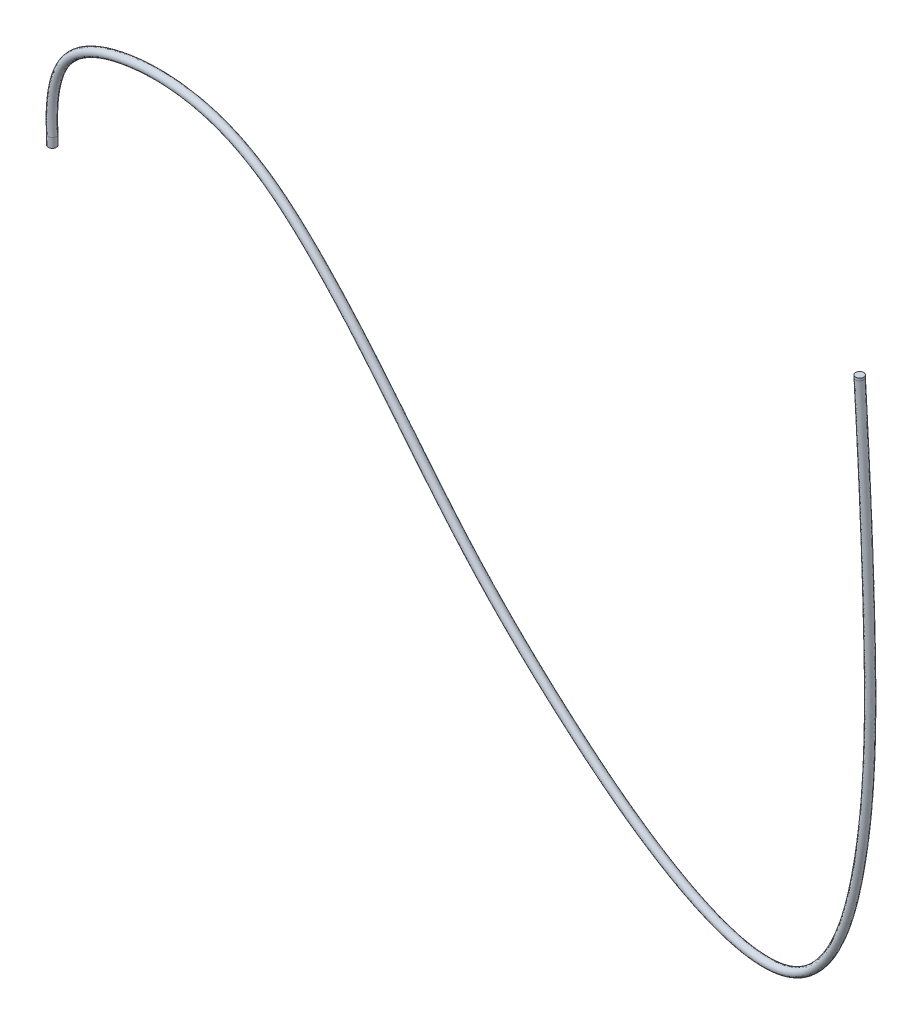
ISO-10303-21;
HEADER;
FILE_DESCRIPTION(('STEP AP214'),'2;1');
FILE_NAME('part.step','',(''),(''),'','','');
FILE_SCHEMA(('AUTOMOTIVE_DESIGN { 1 0 10303 214 1 1 1 1 }'));
ENDSEC;
DATA;
#1=APPLICATION_CONTEXT('core data for automotive mechanical design processes');
#2=APPLICATION_PROTOCOL_DEFINITION('international standard','automotive_design',2000,#1);
#3=PRODUCT_CONTEXT('',#1,'mechanical');
#4=PRODUCT('Part','Part','',(#3));
#5=PRODUCT_RELATED_PRODUCT_CATEGORY('part','',(#4));
#6=PRODUCT_DEFINITION_FORMATION('','',#4);
#7=PRODUCT_DEFINITION_CONTEXT('part definition',#1,'design');
#8=PRODUCT_DEFINITION('design','',#6,#7);
#9=PRODUCT_DEFINITION_SHAPE('','',#8);
#10=(LENGTH_UNIT() NAMED_UNIT(*) SI_UNIT(.MILLI.,.METRE.));
#11=(NAMED_UNIT(*) PLANE_ANGLE_UNIT() SI_UNIT($,.RADIAN.));
#12=(NAMED_UNIT(*) SI_UNIT($,.STERADIAN.) SOLID_ANGLE_UNIT());
#13=UNCERTAINTY_MEASURE_WITH_UNIT(LENGTH_MEASURE(1.E-05),#10,'distance_accuracy_value','');
#14=(GEOMETRIC_REPRESENTATION_CONTEXT(3) GLOBAL_UNCERTAINTY_ASSIGNED_CONTEXT((#13)) GLOBAL_UNIT_ASSIGNED_CONTEXT((#10,
#11,#12)) REPRESENTATION_CONTEXT('',''));
#15=CARTESIAN_POINT('',(0.,0.,0.));
#16=DIRECTION('',(0.,0.,1.));
#17=DIRECTION('',(1.,0.,0.));
#18=AXIS2_PLACEMENT_3D('',#15,#16,#17);
#19=CARTESIAN_POINT('',(0.,0.,0.));
#20=DIRECTION('',(0.,1.,0.));
#21=DIRECTION('',(0.,0.,1.));
#22=AXIS2_PLACEMENT_3D('',#19,#20,#21);
#23=PLANE('',#22);
#24=CARTESIAN_POINT('',(0.,0.,0.));
#25=DIRECTION('',(0.,1.,0.));
#26=DIRECTION('',(0.,0.,1.));
#27=AXIS2_PLACEMENT_3D('',#24,#25,#26);
#28=CIRCLE('',#27,2.);
#29=CARTESIAN_POINT('',(0.,0.,2.));
#30=VERTEX_POINT('',#29);
#31=EDGE_CURVE('E10',#30,#30,#28,.T.);
#32=ORIENTED_EDGE('',*,*,#31,.T.);
#33=EDGE_LOOP('',(#32));
#34=FACE_BOUND('',#33,.T.);
#35=ADVANCED_FACE('F32',(#34),#23,.T.);
#36=CARTESIAN_POINT('',(0.,-6.91801695001233,0.));
#37=DIRECTION('',(0.,1.,0.));
#38=DIRECTION('',(0.,0.,1.));
#39=AXIS2_PLACEMENT_3D('',#36,#37,#38);
#40=CYLINDRICAL_SURFACE('',#39,2.);
#41=ORIENTED_EDGE('',*,*,#31,.F.);
#42=EDGE_LOOP('',(#41));
#43=FACE_BOUND('',#42,.T.);
#44=CARTESIAN_POINT('',(2.,-1.20167860101731,0.));
#45=CARTESIAN_POINT('',(2.,-1.20167860101731,-3.99999999999999));
#46=CARTESIAN_POINT('',(-2.,-1.32064680002261,-3.99999999999999));
#47=CARTESIAN_POINT('',(-2.,-1.32064680002261,0.));
#48=CARTESIAN_POINT('',(-2.,-1.32064680002261,3.99999999999999));
#49=CARTESIAN_POINT('',(2.,-1.20167860101731,3.99999999999999));
#50=CARTESIAN_POINT('',(2.,-1.20167860101731,0.));
#51=(BOUNDED_CURVE() B_SPLINE_CURVE(3,(#44,#45,#46,#47,#48,#49,#50),.UNSPECIFIED.,.T.,
.F.) B_SPLINE_CURVE_WITH_KNOTS((4,3,4),(0.,0.5,1.),
.UNSPECIFIED.) CURVE() GEOMETRIC_REPRESENTATION_ITEM() RATIONAL_B_SPLINE_CURVE((1.,
0.333333333333333,0.333333333333333,1.,0.333333333333333,0.333333333333333,1.)) REPRESENTATION_ITEM(''));
#52=CARTESIAN_POINT('',(2.,-1.20167860101731,0.));
#53=VERTEX_POINT('',#52);
#54=EDGE_CURVE('E43',#53,#53,#51,.T.);
#55=ORIENTED_EDGE('',*,*,#54,.T.);
#56=EDGE_LOOP('',(#55));
#57=FACE_BOUND('',#56,.T.);
#58=ADVANCED_FACE('F34',(#43,#57),#40,.T.);
#59=CARTESIAN_POINT('',(2.,-1.20167860101731,0.));
#60=CARTESIAN_POINT('',(4.09209632883257,-36.3412486678888,0.));
#61=CARTESIAN_POINT('',(7.63154818105791,-107.119674821732,0.));
#62=CARTESIAN_POINT('',(7.60281751624326,-184.57573708266,0.));
#63=CARTESIAN_POINT('',(-2.55177278520474,-230.252125044007,0.));
#64=CARTESIAN_POINT('',(-7.37323858597522,-244.625196915222,0.));
#65=CARTESIAN_POINT('',(-13.5098471687096,-256.803998395114,0.));
#66=CARTESIAN_POINT('',(-20.7481135707305,-265.798434653187,0.));
#67=CARTESIAN_POINT('',(-28.735385011674,-271.601146114843,0.));
#68=CARTESIAN_POINT('',(-36.943196454469,-274.655837359054,0.));
#69=CARTESIAN_POINT('',(-45.8511716276996,-275.596206393729,0.));
#70=CARTESIAN_POINT('',(-56.5297421736927,-274.603695265691,0.));
#71=CARTESIAN_POINT('',(-69.0165226481825,-271.112169248185,0.));
#72=CARTESIAN_POINT('',(-83.2108220844336,-264.890127201743,0.));
#73=CARTESIAN_POINT('',(-109.977965560731,-249.707581328504,0.));
#74=CARTESIAN_POINT('',(-147.281271932621,-219.939138053884,0.));
#75=CARTESIAN_POINT('',(-206.542439237909,-162.662024936289,0.));
#76=CARTESIAN_POINT('',(-247.455277078127,-103.666310294935,0.));
#77=CARTESIAN_POINT('',(-289.382000048682,-65.506248383779,0.));
#78=CARTESIAN_POINT('',(-310.443975711383,-52.8751112809222,0.));
#79=CARTESIAN_POINT('',(-334.465587944927,-46.3023522849033,0.));
#80=CARTESIAN_POINT('',(-354.620704875607,-46.6701761479893,0.));
#81=CARTESIAN_POINT('',(-369.004459641847,-49.8010073886603,0.));
#82=CARTESIAN_POINT('',(-377.155015425856,-52.8674715996089,0.));
#83=CARTESIAN_POINT('',(-384.215664713979,-57.2236472783501,0.));
#84=CARTESIAN_POINT('',(-390.281832966444,-63.7318319338485,0.));
#85=CARTESIAN_POINT('',(-394.060781874633,-73.1725310598896,0.));
#86=CARTESIAN_POINT('',(-395.576889200806,-84.511074589953,0.));
#87=CARTESIAN_POINT('',(-395.456280055112,-92.1672646211098,0.));
#88=CARTESIAN_POINT('',(-395.192421559398,-96.077122967909,0.));
#89=CARTESIAN_POINT('',(2.,-1.20167860101731,-3.99999999999999));
#90=CARTESIAN_POINT('',(4.08748942825784,-36.2638695800783,-3.99999999999999));
#91=CARTESIAN_POINT('',(7.6338468628958,-107.158284273119,-3.99999999999999));
#92=CARTESIAN_POINT('',(7.60273592791559,-184.574366697024,-3.99999999999999));
#93=CARTESIAN_POINT('',(-2.55176693888251,-230.252223240848,-3.99999999999999));
#94=CARTESIAN_POINT('',(-7.37323989795106,-244.625174878824,-3.99999999999999));
#95=CARTESIAN_POINT('',(-13.5098468742248,-256.804003341382,-3.99999999999999));
#96=CARTESIAN_POINT('',(-20.7481136205165,-265.798433816965,-3.99999999999999));
#97=CARTESIAN_POINT('',(-28.7353850006096,-271.601146300685,-3.99999999999999));
#98=CARTESIAN_POINT('',(-36.943196457556,-274.655837307203,-3.99999999999999));
#99=CARTESIAN_POINT('',(-45.8511716267897,-275.596206409013,-3.99999999999999));
#100=CARTESIAN_POINT('',(-56.5297421740808,-274.603695259167,-3.99999999999999));
#101=CARTESIAN_POINT('',(-69.0165226480589,-271.112169250289,-3.99999999999999));
#102=CARTESIAN_POINT('',(-83.2108220844123,-264.890127201975,-3.99999999999999));
#103=CARTESIAN_POINT('',(-109.977965561231,-249.70758132119,-3.99999999999999));
#104=CARTESIAN_POINT('',(-147.281271924213,-219.939138178435,-3.99999999999999));
#105=CARTESIAN_POINT('',(-206.542439284356,-162.662024248058,-3.99999999999999));
#106=CARTESIAN_POINT('',(-247.4552768585,-103.666313549373,-3.99999999999999));
#107=CARTESIAN_POINT('',(-289.382000194613,-65.5062462213601,-3.99999999999999));
#108=CARTESIAN_POINT('',(-310.443975176542,-52.8751192061925,-3.99999999999999));
#109=CARTESIAN_POINT('',(-334.465590050852,-46.3023210792876,-3.99999999999999));
#110=CARTESIAN_POINT('',(-354.62069856385,-46.6702696756819,-3.99999999999999));
#111=CARTESIAN_POINT('',(-369.00446687124,-49.8009002634291,-3.99999999999999));
#112=CARTESIAN_POINT('',(-377.154989117491,-52.8678614372718,-3.99999999999999));
#113=CARTESIAN_POINT('',(-384.215756572933,-57.2222861112845,-3.99999999999999));
#114=CARTESIAN_POINT('',(-390.281451444529,-63.7374853301488,-3.99999999999999));
#115=CARTESIAN_POINT('',(-394.062853625276,-73.1418318340826,-3.99999999999999));
#116=CARTESIAN_POINT('',(-395.568838030029,-84.6303769348672,-3.99999999999999));
#117=CARTESIAN_POINT('',(-395.473272345995,-91.9154726514848,-3.99999999999999));
#118=CARTESIAN_POINT('',(-395.192421559398,-96.077122967909,-3.99999999999999));
#119=CARTESIAN_POINT('',(-2.,-1.32064680002261,-3.99999999999999));
#120=CARTESIAN_POINT('',(0.0874894282578474,-36.3828377790836,-3.99999999999999));
#121=CARTESIAN_POINT('',(3.65541011381,-107.141547738779,-3.99999999999999));
#122=CARTESIAN_POINT('',(3.54664522588683,-184.321113256399,-3.99999999999999));
#123=CARTESIAN_POINT('',(-6.38897944424302,-229.092650338091,-3.99999999999999));
#124=CARTESIAN_POINT('',(-11.0515399042789,-243.016729123848,-3.99999999999999));
#125=CARTESIAN_POINT('',(-16.8750239568385,-254.587703072781,-3.99999999999999));
#126=CARTESIAN_POINT('',(-23.521632542155,-262.846076920583,-3.99999999999999));
#127=CARTESIAN_POINT('',(-30.5672826427588,-267.986115787477,-3.99999999999999));
#128=CARTESIAN_POINT('',(-37.7065528028258,-270.682161040933,-3.99999999999999));
#129=CARTESIAN_POINT('',(-45.7108784869363,-271.571554454419,-3.99999999999999));
#130=CARTESIAN_POINT('',(-55.6063481717664,-270.686608293277,-3.99999999999999));
#131=CARTESIAN_POINT('',(-67.5071550901659,-267.392901163554,-3.99999999999999));
#132=CARTESIAN_POINT('',(-81.2777259374007,-261.378106377015,-3.99999999999999));
#133=CARTESIAN_POINT('',(-107.517259364157,-246.524675396873,-3.99999999999999));
#134=CARTESIAN_POINT('',(-144.503132059096,-217.0521449472,-3.99999999999999));
#135=CARTESIAN_POINT('',(-203.472732496396,-160.095842658378,-3.99999999999999));
#136=CARTESIAN_POINT('',(-243.99544501063,-101.481635825758,-3.99999999999999));
#137=CARTESIAN_POINT('',(-286.826848517044,-62.3958119510024,-3.99999999999999));
#138=CARTESIAN_POINT('',(-308.677701354009,-49.2217685845664,-3.99999999999999));
#139=CARTESIAN_POINT('',(-333.911050894915,-42.2859733212464,-3.99999999999999));
#140=CARTESIAN_POINT('',(-354.81201759441,-42.6416617013587,-3.99999999999999));
#141=CARTESIAN_POINT('',(-369.979720456421,-45.9044509259713,-3.99999999999999));
#142=CARTESIAN_POINT('',(-378.757647677056,-49.178717753331,-3.99999999999999));
#143=CARTESIAN_POINT('',(-386.603704198294,-53.9422730293328,-3.99999999999999));
#144=CARTESIAN_POINT('',(-393.716457547658,-61.501957282843,-3.99999999999999));
#145=CARTESIAN_POINT('',(-397.969660703909,-72.1182099975271,-3.99999999999999));
#146=CARTESIAN_POINT('',(-399.569866399197,-84.2262133099852,-3.99999999999999));
#147=CARTESIAN_POINT('',(-399.473272345995,-92.050290198752,-3.99999999999999));
#148=CARTESIAN_POINT('',(-399.192421559398,-96.2119405151762,-3.99999999999999));
#149=CARTESIAN_POINT('',(-2.,-1.32064680002261,0.));
#150=CARTESIAN_POINT('',(0.0897928785452102,-36.4215273229889,0.));
#151=CARTESIAN_POINT('',(3.65426077289104,-107.122243013086,0.));
#152=CARTESIAN_POINT('',(3.54668602005069,-184.321798449217,0.));
#153=CARTESIAN_POINT('',(-6.38898236740414,-229.09260123967,0.));
#154=CARTESIAN_POINT('',(-11.051539248291,-243.016740142047,0.));
#155=CARTESIAN_POINT('',(-16.8750241040809,-254.587700599647,0.));
#156=CARTESIAN_POINT('',(-23.5216325172619,-262.846077338695,0.));
#157=CARTESIAN_POINT('',(-30.567282648291,-267.986115694557,0.));
#158=CARTESIAN_POINT('',(-37.7065528012823,-270.682161066859,0.));
#159=CARTESIAN_POINT('',(-45.7108784873912,-271.571554446777,0.));
#160=CARTESIAN_POINT('',(-55.6063481715724,-270.686608296539,0.));
#161=CARTESIAN_POINT('',(-67.5071550902277,-267.392901162501,0.));
#162=CARTESIAN_POINT('',(-81.2777259374114,-261.378106376899,0.));
#163=CARTESIAN_POINT('',(-107.517259363907,-246.52467540053,0.));
#164=CARTESIAN_POINT('',(-144.5031320633,-217.052144884925,0.));
#165=CARTESIAN_POINT('',(-203.472732473172,-160.095843002493,0.));
#166=CARTESIAN_POINT('',(-243.995445120443,-101.481634198539,0.));
#167=CARTESIAN_POINT('',(-286.826848444078,-62.3958130322119,0.));
#168=CARTESIAN_POINT('',(-308.677701621429,-49.2217646219312,0.));
#169=CARTESIAN_POINT('',(-333.911049841953,-42.2859889240542,0.));
#170=CARTESIAN_POINT('',(-354.812020750288,-42.6416149375124,0.));
#171=CARTESIAN_POINT('',(-369.979716841724,-45.9045044885869,0.));
#172=CARTESIAN_POINT('',(-378.757660831238,-49.1785228344996,0.));
#173=CARTESIAN_POINT('',(-386.603658268817,-53.9429536128656,0.));
#174=CARTESIAN_POINT('',(-393.716648308615,-61.4991305846929,0.));
#175=CARTESIAN_POINT('',(-397.968624828588,-72.1335596104306,0.));
#176=CARTESIAN_POINT('',(-399.573891984585,-84.166562137528,0.));
#177=CARTESIAN_POINT('',(-399.464776200554,-92.1761861835645,0.));
#178=CARTESIAN_POINT('',(-399.192421559398,-96.2119405151762,0.));
#179=CARTESIAN_POINT('',(-2.,-1.32064680002261,3.99999999999999));
#180=CARTESIAN_POINT('',(0.0920963288325731,-36.4602168668941,3.99999999999999));
#181=CARTESIAN_POINT('',(3.65311143197208,-107.102938287392,3.99999999999999));
#182=CARTESIAN_POINT('',(3.54672681421454,-184.322483642035,3.99999999999999));
#183=CARTESIAN_POINT('',(-6.38898529056526,-229.09255214125,3.99999999999999));
#184=CARTESIAN_POINT('',(-11.051538592303,-243.016751160245,3.99999999999999));
#185=CARTESIAN_POINT('',(-16.8750242513233,-254.587698126513,3.99999999999999));
#186=CARTESIAN_POINT('',(-23.521632492369,-262.846077756806,3.99999999999999));
#187=CARTESIAN_POINT('',(-30.5672826538232,-267.986115601636,3.99999999999999));
#188=CARTESIAN_POINT('',(-37.7065527997388,-270.682161092784,3.99999999999999));
#189=CARTESIAN_POINT('',(-45.7108784878461,-271.571554439136,3.99999999999999));
#190=CARTESIAN_POINT('',(-55.6063481713783,-270.686608299801,3.99999999999999));
#191=CARTESIAN_POINT('',(-67.5071550902895,-267.392901161449,3.99999999999999));
#192=CARTESIAN_POINT('',(-81.277725937422,-261.378106376783,3.99999999999999));
#193=CARTESIAN_POINT('',(-107.517259363657,-246.524675404187,3.99999999999999));
#194=CARTESIAN_POINT('',(-144.503132067504,-217.052144822649,3.99999999999999));
#195=CARTESIAN_POINT('',(-203.472732449949,-160.095843346609,3.99999999999999));
#196=CARTESIAN_POINT('',(-243.995445230257,-101.48163257132,3.99999999999999));
#197=CARTESIAN_POINT('',(-286.826848371113,-62.3958141134213,3.99999999999999));
#198=CARTESIAN_POINT('',(-308.677701888849,-49.2217606592961,3.99999999999999));
#199=CARTESIAN_POINT('',(-333.911048788991,-42.2860045268621,3.99999999999999));
#200=CARTESIAN_POINT('',(-354.812023906167,-42.6415681736661,3.99999999999999));
#201=CARTESIAN_POINT('',(-369.979713227028,-45.9045580512025,3.99999999999999));
#202=CARTESIAN_POINT('',(-378.757673985421,-49.1783279156681,3.99999999999999));
#203=CARTESIAN_POINT('',(-386.603612339341,-53.9436341963985,3.99999999999999));
#204=CARTESIAN_POINT('',(-393.716839069573,-61.4963038865428,3.99999999999999));
#205=CARTESIAN_POINT('',(-397.967588953266,-72.1489092233341,3.99999999999999));
#206=CARTESIAN_POINT('',(-399.577917569974,-84.106910965071,3.99999999999999));
#207=CARTESIAN_POINT('',(-399.456280055112,-92.302082168377,3.99999999999999));
#208=CARTESIAN_POINT('',(-399.192421559398,-96.2119405151762,3.99999999999999));
#209=CARTESIAN_POINT('',(2.,-1.20167860101731,3.99999999999999));
#210=CARTESIAN_POINT('',(4.09670322940729,-36.4186277556992,3.99999999999999));
#211=CARTESIAN_POINT('',(7.62924949921998,-107.081065370345,3.99999999999999));
#212=CARTESIAN_POINT('',(7.60289910457099,-184.577107468296,3.99999999999999));
#213=CARTESIAN_POINT('',(-2.55177863152699,-230.252026847166,3.99999999999999));
#214=CARTESIAN_POINT('',(-7.37323727399937,-244.62521895162,3.99999999999999));
#215=CARTESIAN_POINT('',(-13.5098474631943,-256.803993448846,3.99999999999999));
#216=CARTESIAN_POINT('',(-20.7481135209445,-265.79843548941,3.99999999999999));
#217=CARTESIAN_POINT('',(-28.7353850227384,-271.601145929001,3.99999999999999));
#218=CARTESIAN_POINT('',(-36.943196451382,-274.655837410904,3.99999999999999));
#219=CARTESIAN_POINT('',(-45.8511716286094,-275.596206378446,3.99999999999999));
#220=CARTESIAN_POINT('',(-56.5297421733046,-274.603695272214,3.99999999999999));
#221=CARTESIAN_POINT('',(-69.0165226483061,-271.11216924608,3.99999999999999));
#222=CARTESIAN_POINT('',(-83.2108220844549,-264.890127201511,3.99999999999999));
#223=CARTESIAN_POINT('',(-109.977965560231,-249.707581335817,3.99999999999999));
#224=CARTESIAN_POINT('',(-147.281271941029,-219.939137929332,3.99999999999999));
#225=CARTESIAN_POINT('',(-206.542439191462,-162.66202562452,3.99999999999999));
#226=CARTESIAN_POINT('',(-247.455277297754,-103.666307040497,3.99999999999999));
#227=CARTESIAN_POINT('',(-289.38199990275,-65.506250546198,3.99999999999999));
#228=CARTESIAN_POINT('',(-310.443976246223,-52.8751033556518,3.99999999999999));
#229=CARTESIAN_POINT('',(-334.465585839002,-46.302383490519,3.99999999999999));
#230=CARTESIAN_POINT('',(-354.620711187364,-46.6700826202966,3.99999999999999));
#231=CARTESIAN_POINT('',(-369.004452412454,-49.8011145138915,3.99999999999999));
#232=CARTESIAN_POINT('',(-377.155041734221,-52.867081761946,3.99999999999999));
#233=CARTESIAN_POINT('',(-384.215572855026,-57.2250084454158,3.99999999999999));
#234=CARTESIAN_POINT('',(-390.282214488359,-63.7261785375483,3.99999999999999));
#235=CARTESIAN_POINT('',(-394.058710123991,-73.2032302856965,3.99999999999999));
#236=CARTESIAN_POINT('',(-395.584940371583,-84.3917722450388,3.99999999999999));
#237=CARTESIAN_POINT('',(-395.43928776423,-92.4190565907349,3.99999999999999));
#238=CARTESIAN_POINT('',(-395.192421559398,-96.077122967909,3.99999999999999));
#239=CARTESIAN_POINT('',(2.,-1.20167860101731,0.));
#240=CARTESIAN_POINT('',(4.09209632883257,-36.3412486678888,0.));
#241=CARTESIAN_POINT('',(7.63154818105791,-107.119674821732,0.));
#242=CARTESIAN_POINT('',(7.60281751624326,-184.57573708266,0.));
#243=CARTESIAN_POINT('',(-2.55177278520474,-230.252125044007,0.));
#244=CARTESIAN_POINT('',(-7.37323858597522,-244.625196915222,0.));
#245=CARTESIAN_POINT('',(-13.5098471687096,-256.803998395114,0.));
#246=CARTESIAN_POINT('',(-20.7481135707305,-265.798434653187,0.));
#247=CARTESIAN_POINT('',(-28.735385011674,-271.601146114843,0.));
#248=CARTESIAN_POINT('',(-36.943196454469,-274.655837359054,0.));
#249=CARTESIAN_POINT('',(-45.8511716276996,-275.596206393729,0.));
#250=CARTESIAN_POINT('',(-56.5297421736927,-274.603695265691,0.));
#251=CARTESIAN_POINT('',(-69.0165226481825,-271.112169248185,0.));
#252=CARTESIAN_POINT('',(-83.2108220844336,-264.890127201743,0.));
#253=CARTESIAN_POINT('',(-109.977965560731,-249.707581328504,0.));
#254=CARTESIAN_POINT('',(-147.281271932621,-219.939138053884,0.));
#255=CARTESIAN_POINT('',(-206.542439237909,-162.662024936289,0.));
#256=CARTESIAN_POINT('',(-247.455277078127,-103.666310294935,0.));
#257=CARTESIAN_POINT('',(-289.382000048682,-65.506248383779,0.));
#258=CARTESIAN_POINT('',(-310.443975711383,-52.8751112809222,0.));
#259=CARTESIAN_POINT('',(-334.465587944927,-46.3023522849033,0.));
#260=CARTESIAN_POINT('',(-354.620704875607,-46.6701761479893,0.));
#261=CARTESIAN_POINT('',(-369.004459641847,-49.8010073886603,0.));
#262=CARTESIAN_POINT('',(-377.155015425856,-52.8674715996089,0.));
#263=CARTESIAN_POINT('',(-384.215664713979,-57.2236472783501,0.));
#264=CARTESIAN_POINT('',(-390.281832966444,-63.7318319338485,0.));
#265=CARTESIAN_POINT('',(-394.060781874633,-73.1725310598896,0.));
#266=CARTESIAN_POINT('',(-395.576889200806,-84.511074589953,0.));
#267=CARTESIAN_POINT('',(-395.456280055112,-92.1672646211098,0.));
#268=CARTESIAN_POINT('',(-395.192421559398,-96.077122967909,0.));
#269=(BOUNDED_SURFACE() B_SPLINE_SURFACE(3,3,((#59,#60,#61,#62,#63,#64,#65,#66,#67,#68,#69,#70,
#71,#72,#73,#74,#75,#76,#77,#78,#79,#80,#81,#82,#83,#84,#85,#86,#87,#88),(#89,#90,#91,#92,#93,
#94,#95,#96,#97,#98,#99,#100,#101,#102,#103,#104,#105,#106,#107,#108,#109,#110,#111,#112,#113,
#114,#115,#116,#117,#118),(#119,#120,#121,#122,#123,#124,#125,#126,#127,#128,#129,#130,#131,
#132,#133,#134,#135,#136,#137,#138,#139,#140,#141,#142,#143,#144,#145,#146,#147,#148),(#149,
#150,#151,#152,#153,#154,#155,#156,#157,#158,#159,#160,#161,#162,#163,#164,#165,#166,#167,#168,
#169,#170,#171,#172,#173,#174,#175,#176,#177,#178),(#179,#180,#181,#182,#183,#184,#185,#186,
#187,#188,#189,#190,#191,#192,#193,#194,#195,#196,#197,#198,#199,#200,#201,#202,#203,#204,#205,
#206,#207,#208),(#209,#210,#211,#212,#213,#214,#215,#216,#217,#218,#219,#220,#221,#222,#223,
#224,#225,#226,#227,#228,#229,#230,#231,#232,#233,#234,#235,#236,#237,#238),(#239,#240,#241,
#242,#243,#244,#245,#246,#247,#248,#249,#250,#251,#252,#253,#254,#255,#256,#257,#258,#259,#260,
#261,#262,#263,#264,#265,#266,#267,#268)),.UNSPECIFIED.,.T.,.F.,
.F.) B_SPLINE_SURFACE_WITH_KNOTS((4,3,4),(4,1,1,1,1,1,1,1,1,1,1,1,1,1,1,1,1,1,1,1,1,1,1,1,1,1,1,
4),(0.,0.5,1.),(0.,0.137829806982261,0.27803726599004,0.299711320883297,0.319198679569008,
0.336449340114623,0.351716566273209,0.362320142087683,0.372785204649803,0.383726760885534,
0.395591321613057,0.413248679818974,0.433190379782685,0.455350003115741,0.532510275102997,
0.618365404653799,0.776781374910848,0.810195884437844,0.841785453521202,0.873567747343185,
0.908565693087866,0.92069607281397,0.932432072793952,0.943601328857131,0.954380382894544,
0.969145435039036,0.984705098551379,1.),
.UNSPECIFIED.) GEOMETRIC_REPRESENTATION_ITEM() RATIONAL_B_SPLINE_SURFACE(((1.,1.,1.,
0.999999999999999,1.,1.,1.,1.,1.,1.,1.,1.,1.,1.,1.,1.,1.,1.,1.,1.,1.,1.,1.,1.,1.,1.,1.,1.,1.,
1.),(0.333333333333333,0.333333333333333,0.333333333333333,0.333333333333333,0.333333333333333,
0.333333333333333,0.333333333333333,0.333333333333333,0.333333333333333,0.333333333333333,
0.333333333333333,0.333333333333333,0.333333333333333,0.333333333333333,0.333333333333333,
0.333333333333333,0.333333333333333,0.333333333333333,0.333333333333333,0.333333333333333,
0.333333333333333,0.333333333333333,0.333333333333333,0.333333333333333,0.333333333333333,
0.333333333333333,0.333333333333333,0.333333333333333,0.333333333333333,0.333333333333333),
(0.333333333333333,0.333333333333333,0.333333333333333,0.333333333333333,0.333333333333333,
0.333333333333333,0.333333333333333,0.333333333333333,0.333333333333333,0.333333333333333,
0.333333333333333,0.333333333333333,0.333333333333333,0.333333333333333,0.333333333333333,
0.333333333333333,0.333333333333333,0.333333333333333,0.333333333333333,0.333333333333333,
0.333333333333333,0.333333333333333,0.333333333333333,0.333333333333333,0.333333333333333,
0.333333333333333,0.333333333333333,0.333333333333333,0.333333333333333,0.333333333333333),(1.,
1.,1.,0.999999999999999,1.,1.,1.,1.,1.,1.,1.,1.,1.,1.,1.,1.,1.,1.,1.,1.,1.,1.,1.,1.,1.,1.,1.,1.,
1.,1.),(0.333333333333333,0.333333333333333,0.333333333333333,0.333333333333333,
0.333333333333333,0.333333333333333,0.333333333333333,0.333333333333333,0.333333333333333,
0.333333333333333,0.333333333333333,0.333333333333333,0.333333333333333,0.333333333333333,
0.333333333333333,0.333333333333333,0.333333333333333,0.333333333333333,0.333333333333333,
0.333333333333333,0.333333333333333,0.333333333333333,0.333333333333333,0.333333333333333,
0.333333333333333,0.333333333333333,0.333333333333333,0.333333333333333,0.333333333333333,
0.333333333333333),(0.333333333333333,0.333333333333333,0.333333333333333,0.333333333333333,
0.333333333333333,0.333333333333333,0.333333333333333,0.333333333333333,0.333333333333333,
0.333333333333333,0.333333333333333,0.333333333333333,0.333333333333333,0.333333333333333,
0.333333333333333,0.333333333333333,0.333333333333333,0.333333333333333,0.333333333333333,
0.333333333333333,0.333333333333333,0.333333333333333,0.333333333333333,0.333333333333333,
0.333333333333333,0.333333333333333,0.333333333333333,0.333333333333333,0.333333333333333,
0.333333333333333),(1.,1.,1.,0.999999999999999,1.,1.,1.,1.,1.,1.,1.,1.,1.,1.,1.,1.,1.,1.,1.,1.,
1.,1.,1.,1.,1.,1.,1.,1.,1.,1.))) REPRESENTATION_ITEM('') SURFACE());
#270=CARTESIAN_POINT('',(-395.192421559398,-96.077122967909,0.));
#271=CARTESIAN_POINT('',(-395.192421559398,-96.077122967909,-3.99999999999999));
#272=CARTESIAN_POINT('',(-399.192421559398,-96.2119405151762,-3.99999999999999));
#273=CARTESIAN_POINT('',(-399.192421559398,-96.2119405151762,0.));
#274=CARTESIAN_POINT('',(-399.192421559398,-96.2119405151762,3.99999999999999));
#275=CARTESIAN_POINT('',(-395.192421559398,-96.077122967909,3.99999999999999));
#276=CARTESIAN_POINT('',(-395.192421559398,-96.077122967909,0.));
#277=(BOUNDED_CURVE() B_SPLINE_CURVE(3,(#270,#271,#272,#273,#274,#275,#276),.UNSPECIFIED.,.T.,
.F.) B_SPLINE_CURVE_WITH_KNOTS((4,3,4),(0.,0.5,1.),
.UNSPECIFIED.) CURVE() GEOMETRIC_REPRESENTATION_ITEM() RATIONAL_B_SPLINE_CURVE((1.,
0.333333333333333,0.333333333333333,1.,0.333333333333333,0.333333333333333,1.)) REPRESENTATION_ITEM(''));
#278=CARTESIAN_POINT('',(-395.192421559398,-96.077122967909,0.));
#279=VERTEX_POINT('',#278);
#280=EDGE_CURVE('E39',#279,#279,#277,.F.);
#281=ORIENTED_EDGE('',*,*,#54,.F.);
#282=EDGE_LOOP('',(#281));
#283=FACE_BOUND('',#282,.T.);
#284=ORIENTED_EDGE('',*,*,#280,.F.);
#285=EDGE_LOOP('',(#284));
#286=FACE_BOUND('',#285,.T.);
#287=ADVANCED_FACE('F67',(#283,#286),#269,.F.);
#288=CARTESIAN_POINT('',(-399.192421559398,-100.732280006815,0.));
#289=DIRECTION('',(0.,1.,0.));
#290=DIRECTION('',(0.,0.,1.));
#291=AXIS2_PLACEMENT_3D('',#288,#289,#290);
#292=PLANE('',#291);
#293=CARTESIAN_POINT('',(-397.192421559398,-100.732280006815,0.));
#294=DIRECTION('',(0.,1.,0.));
#295=DIRECTION('',(0.,0.,1.));
#296=AXIS2_PLACEMENT_3D('',#293,#294,#295);
#297=CIRCLE('',#296,2.00000000000003);
#298=CARTESIAN_POINT('',(-397.192421559398,-100.732280006815,2.00000000000003));
#299=VERTEX_POINT('',#298);
#300=EDGE_CURVE('E47',#299,#299,#297,.T.);
#301=ORIENTED_EDGE('',*,*,#300,.F.);
#302=EDGE_LOOP('',(#301));
#303=FACE_BOUND('',#302,.T.);
#304=ADVANCED_FACE('F65',(#303),#292,.F.);
#305=CARTESIAN_POINT('',(-395.192421559398,-96.077122967909,0.));
#306=CARTESIAN_POINT('',(-395.192421559398,-100.732280006815,0.));
#307=CARTESIAN_POINT('',(-395.192421559398,-96.077122967909,3.99999999999999));
#308=CARTESIAN_POINT('',(-395.192421559398,-100.732280006815,3.99999999999999));
#309=CARTESIAN_POINT('',(-399.192421559398,-96.2119405151762,3.99999999999999));
#310=CARTESIAN_POINT('',(-399.192421559398,-100.732280006815,3.99999999999999));
#311=CARTESIAN_POINT('',(-399.192421559398,-96.2119405151762,0.));
#312=CARTESIAN_POINT('',(-399.192421559398,-100.732280006815,0.));
#313=CARTESIAN_POINT('',(-399.192421559398,-96.2119405151762,-3.99999999999999));
#314=CARTESIAN_POINT('',(-399.192421559398,-100.732280006815,-3.99999999999999));
#315=CARTESIAN_POINT('',(-395.192421559398,-96.077122967909,-3.99999999999999));
#316=CARTESIAN_POINT('',(-395.192421559398,-100.732280006815,-3.99999999999999));
#317=CARTESIAN_POINT('',(-395.192421559398,-96.077122967909,0.));
#318=CARTESIAN_POINT('',(-395.192421559398,-100.732280006815,0.));
#319=(BOUNDED_SURFACE() B_SPLINE_SURFACE(3,1,((#305,#306),(#307,#308),(#309,#310),(#311,#312),
(#313,#314),(#315,#316),(#317,#318)),.UNSPECIFIED.,.T.,.F.,.F.) B_SPLINE_SURFACE_WITH_KNOTS((4,
3,4),(2,2),(0.,0.5,1.),(0.,1.),
.UNSPECIFIED.) GEOMETRIC_REPRESENTATION_ITEM() RATIONAL_B_SPLINE_SURFACE(((1.,1.),
(0.333333333333333,0.333333333333333),(0.333333333333333,0.333333333333333),(1.,1.),
(0.333333333333333,0.333333333333333),(0.333333333333333,0.333333333333333),(1.,1.))) REPRESENTATION_ITEM('') SURFACE());
#320=ORIENTED_EDGE('',*,*,#280,.T.);
#321=EDGE_LOOP('',(#320));
#322=FACE_BOUND('',#321,.T.);
#323=ORIENTED_EDGE('',*,*,#300,.T.);
#324=EDGE_LOOP('',(#323));
#325=FACE_BOUND('',#324,.T.);
#326=ADVANCED_FACE('F63',(#322,#325),#319,.T.);
#327=CLOSED_SHELL('',(#35,#58,#287,#304,#326));
#328=MANIFOLD_SOLID_BREP('B2',#327);
#329=ADVANCED_BREP_SHAPE_REPRESENTATION('',(#18,#328),#14);
#330=SHAPE_DEFINITION_REPRESENTATION(#9,#329);
ENDSEC;
END-ISO-10303-21;
